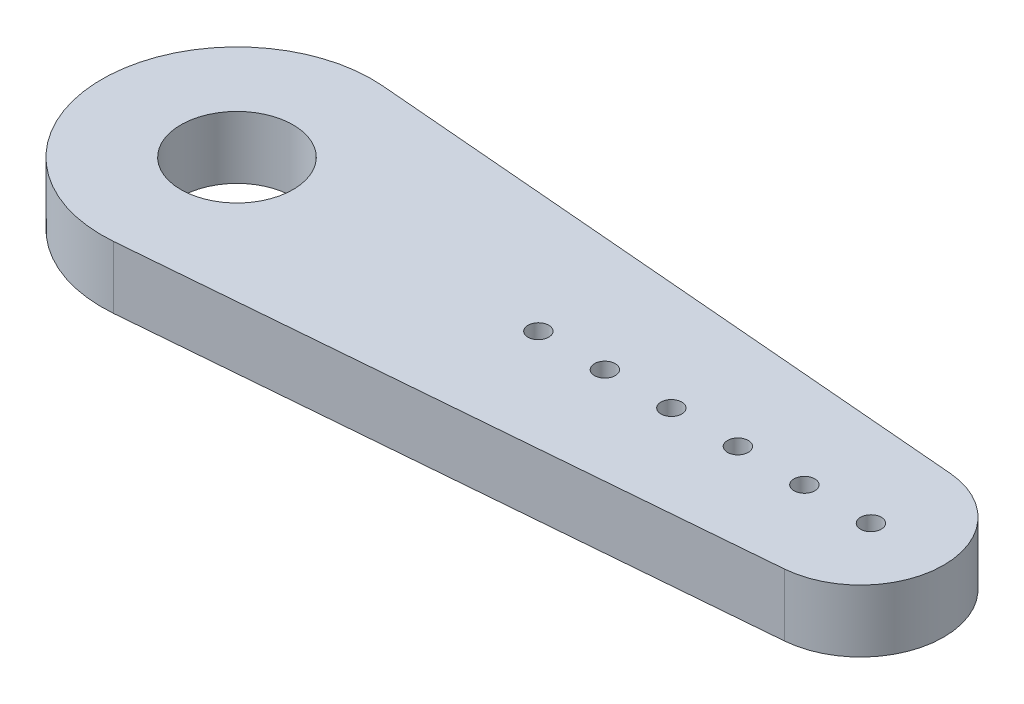
ISO-10303-21;
HEADER;
FILE_DESCRIPTION(('STEP AP214'),'2;1');
FILE_NAME('part.step','',(''),(''),'','','');
FILE_SCHEMA(('AUTOMOTIVE_DESIGN { 1 0 10303 214 1 1 1 1 }'));
ENDSEC;
DATA;
#1=APPLICATION_CONTEXT('core data for automotive mechanical design processes');
#2=APPLICATION_PROTOCOL_DEFINITION('international standard','automotive_design',2000,#1);
#3=PRODUCT_CONTEXT('',#1,'mechanical');
#4=PRODUCT('Part','Part','',(#3));
#5=PRODUCT_RELATED_PRODUCT_CATEGORY('part','',(#4));
#6=PRODUCT_DEFINITION_FORMATION('','',#4);
#7=PRODUCT_DEFINITION_CONTEXT('part definition',#1,'design');
#8=PRODUCT_DEFINITION('design','',#6,#7);
#9=PRODUCT_DEFINITION_SHAPE('','',#8);
#10=(LENGTH_UNIT() NAMED_UNIT(*) SI_UNIT(.MILLI.,.METRE.));
#11=(NAMED_UNIT(*) PLANE_ANGLE_UNIT() SI_UNIT($,.RADIAN.));
#12=(NAMED_UNIT(*) SI_UNIT($,.STERADIAN.) SOLID_ANGLE_UNIT());
#13=UNCERTAINTY_MEASURE_WITH_UNIT(LENGTH_MEASURE(1.E-05),#10,'distance_accuracy_value','');
#14=(GEOMETRIC_REPRESENTATION_CONTEXT(3) GLOBAL_UNCERTAINTY_ASSIGNED_CONTEXT((#13)) GLOBAL_UNIT_ASSIGNED_CONTEXT((#10,
#11,#12)) REPRESENTATION_CONTEXT('',''));
#15=CARTESIAN_POINT('',(0.,0.,0.));
#16=DIRECTION('',(0.,0.,1.));
#17=DIRECTION('',(1.,0.,0.));
#18=AXIS2_PLACEMENT_3D('',#15,#16,#17);
#19=CARTESIAN_POINT('',(0.,3.,0.));
#20=DIRECTION('',(0.,1.,0.));
#21=DIRECTION('',(0.,0.,1.));
#22=AXIS2_PLACEMENT_3D('',#19,#20,#21);
#23=PLANE('',#22);
#24=CARTESIAN_POINT('',(14.5,3.,0.));
#25=DIRECTION('',(0.,1.,0.));
#26=DIRECTION('',(0.,0.,1.));
#27=AXIS2_PLACEMENT_3D('',#24,#25,#26);
#28=CIRCLE('',#27,0.499999999999999);
#29=CARTESIAN_POINT('',(14.5,3.,0.499999999999999));
#30=VERTEX_POINT('',#29);
#31=EDGE_CURVE('E145',#30,#30,#28,.T.);
#32=ORIENTED_EDGE('',*,*,#31,.F.);
#33=EDGE_LOOP('',(#32));
#34=FACE_BOUND('',#33,.T.);
#35=CARTESIAN_POINT('',(20.9,3.,1.41980444495332E-13));
#36=DIRECTION('',(0.,1.,0.));
#37=DIRECTION('',(0.,0.,1.));
#38=AXIS2_PLACEMENT_3D('',#35,#36,#37);
#39=CIRCLE('',#38,0.499999999999999);
#40=CARTESIAN_POINT('',(20.9,3.,0.500000000000141));
#41=VERTEX_POINT('',#40);
#42=EDGE_CURVE('E133',#41,#41,#39,.T.);
#43=ORIENTED_EDGE('',*,*,#42,.F.);
#44=EDGE_LOOP('',(#43));
#45=FACE_BOUND('',#44,.T.);
#46=CARTESIAN_POINT('',(27.3,3.,0.));
#47=DIRECTION('',(0.,1.,0.));
#48=DIRECTION('',(0.,0.,1.));
#49=AXIS2_PLACEMENT_3D('',#46,#47,#48);
#50=CIRCLE('',#49,0.499999999999999);
#51=CARTESIAN_POINT('',(27.3,3.,0.500000000000006));
#52=VERTEX_POINT('',#51);
#53=EDGE_CURVE('E121',#52,#52,#50,.T.);
#54=ORIENTED_EDGE('',*,*,#53,.F.);
#55=EDGE_LOOP('',(#54));
#56=FACE_BOUND('',#55,.T.);
#57=CARTESIAN_POINT('',(0.,3.,0.));
#58=DIRECTION('',(0.,1.,0.));
#59=DIRECTION('',(0.,0.,1.));
#60=AXIS2_PLACEMENT_3D('',#57,#58,#59);
#61=CIRCLE('',#60,6.5);
#62=CARTESIAN_POINT('',(0.541666666666666,3.,-6.47739123584659));
#63=VERTEX_POINT('',#62);
#64=CARTESIAN_POINT('',(0.541666666666666,3.,6.47739123584659));
#65=VERTEX_POINT('',#64);
#66=EDGE_CURVE('E91',#63,#65,#61,.T.);
#67=ORIENTED_EDGE('',*,*,#66,.T.);
#68=DIRECTION('',(0.996521728591783,0.,-0.0833333333333333));
#69=VECTOR('',#68,1.);
#70=CARTESIAN_POINT('',(0.541666666666666,3.,6.47739123584659));
#71=LINE('',#70,#69);
#72=CARTESIAN_POINT('',(30.3333333333333,3.,3.98608691436713));
#73=VERTEX_POINT('',#72);
#74=EDGE_CURVE('E86',#65,#73,#71,.T.);
#75=ORIENTED_EDGE('',*,*,#74,.T.);
#76=CARTESIAN_POINT('',(30.,3.,0.));
#77=DIRECTION('',(0.,1.,0.));
#78=DIRECTION('',(0.,0.,1.));
#79=AXIS2_PLACEMENT_3D('',#76,#77,#78);
#80=CIRCLE('',#79,4.);
#81=CARTESIAN_POINT('',(30.3333333333333,3.,-3.98608691436713));
#82=VERTEX_POINT('',#81);
#83=EDGE_CURVE('E89',#73,#82,#80,.T.);
#84=ORIENTED_EDGE('',*,*,#83,.T.);
#85=DIRECTION('',(-0.996521728591783,0.,-0.0833333333333333));
#86=VECTOR('',#85,1.);
#87=CARTESIAN_POINT('',(0.541666666666666,3.,-6.47739123584659));
#88=LINE('',#87,#86);
#89=EDGE_CURVE('E56',#82,#63,#88,.T.);
#90=ORIENTED_EDGE('',*,*,#89,.T.);
#91=EDGE_LOOP('',(#67,#75,#84,#90));
#92=FACE_BOUND('',#91,.T.);
#93=CARTESIAN_POINT('',(30.5,3.,0.));
#94=DIRECTION('',(0.,1.,0.));
#95=DIRECTION('',(0.,0.,1.));
#96=AXIS2_PLACEMENT_3D('',#93,#94,#95);
#97=CIRCLE('',#96,0.499999999999999);
#98=CARTESIAN_POINT('',(30.5,3.,0.499999999999999));
#99=VERTEX_POINT('',#98);
#100=EDGE_CURVE('E106',#99,#99,#97,.T.);
#101=ORIENTED_EDGE('',*,*,#100,.F.);
#102=EDGE_LOOP('',(#101));
#103=FACE_BOUND('',#102,.T.);
#104=CARTESIAN_POINT('',(24.1,3.,0.));
#105=DIRECTION('',(0.,1.,0.));
#106=DIRECTION('',(0.,0.,1.));
#107=AXIS2_PLACEMENT_3D('',#104,#105,#106);
#108=CIRCLE('',#107,0.499999999999999);
#109=CARTESIAN_POINT('',(24.1,3.,0.50000000000006));
#110=VERTEX_POINT('',#109);
#111=EDGE_CURVE('E127',#110,#110,#108,.T.);
#112=ORIENTED_EDGE('',*,*,#111,.F.);
#113=EDGE_LOOP('',(#112));
#114=FACE_BOUND('',#113,.T.);
#115=CARTESIAN_POINT('',(17.7,3.,3.1870603202946E-13));
#116=DIRECTION('',(0.,1.,0.));
#117=DIRECTION('',(0.,0.,1.));
#118=AXIS2_PLACEMENT_3D('',#115,#116,#117);
#119=CIRCLE('',#118,0.499999999999999);
#120=CARTESIAN_POINT('',(17.7,3.,0.500000000000318));
#121=VERTEX_POINT('',#120);
#122=EDGE_CURVE('E139',#121,#121,#119,.T.);
#123=ORIENTED_EDGE('',*,*,#122,.F.);
#124=EDGE_LOOP('',(#123));
#125=FACE_BOUND('',#124,.T.);
#126=CARTESIAN_POINT('',(0.,3.,0.));
#127=DIRECTION('',(0.,1.,0.));
#128=DIRECTION('',(0.,0.,1.));
#129=AXIS2_PLACEMENT_3D('',#126,#127,#128);
#130=CIRCLE('',#129,2.7);
#131=CARTESIAN_POINT('',(0.,3.,2.7));
#132=VERTEX_POINT('',#131);
#133=EDGE_CURVE('E151',#132,#132,#130,.T.);
#134=ORIENTED_EDGE('',*,*,#133,.F.);
#135=EDGE_LOOP('',(#134));
#136=FACE_BOUND('',#135,.T.);
#137=ADVANCED_FACE('F39',(#34,#45,#56,#92,#103,#114,#125,#136),#23,.T.);
#138=CARTESIAN_POINT('',(0.,0.,0.));
#139=DIRECTION('',(0.,1.,0.));
#140=DIRECTION('',(0.,0.,1.));
#141=AXIS2_PLACEMENT_3D('',#138,#139,#140);
#142=PLANE('',#141);
#143=CARTESIAN_POINT('',(0.,0.,0.));
#144=DIRECTION('',(0.,1.,0.));
#145=DIRECTION('',(0.,0.,1.));
#146=AXIS2_PLACEMENT_3D('',#143,#144,#145);
#147=CIRCLE('',#146,6.5);
#148=CARTESIAN_POINT('',(0.541666666666666,0.,-6.47739123584659));
#149=VERTEX_POINT('',#148);
#150=CARTESIAN_POINT('',(0.541666666666666,0.,6.47739123584659));
#151=VERTEX_POINT('',#150);
#152=EDGE_CURVE('E103',#149,#151,#147,.T.);
#153=ORIENTED_EDGE('',*,*,#152,.F.);
#154=DIRECTION('',(-0.996521728591783,0.,-0.0833333333333333));
#155=VECTOR('',#154,1.);
#156=CARTESIAN_POINT('',(0.541666666666666,0.,-6.47739123584659));
#157=LINE('',#156,#155);
#158=CARTESIAN_POINT('',(30.3333333333333,0.,-3.98608691436713));
#159=VERTEX_POINT('',#158);
#160=EDGE_CURVE('E79',#159,#149,#157,.T.);
#161=ORIENTED_EDGE('',*,*,#160,.F.);
#162=CARTESIAN_POINT('',(30.,0.,0.));
#163=DIRECTION('',(0.,1.,0.));
#164=DIRECTION('',(0.,0.,1.));
#165=AXIS2_PLACEMENT_3D('',#162,#163,#164);
#166=CIRCLE('',#165,4.);
#167=CARTESIAN_POINT('',(30.3333333333333,0.,3.98608691436713));
#168=VERTEX_POINT('',#167);
#169=EDGE_CURVE('E73',#168,#159,#166,.T.);
#170=ORIENTED_EDGE('',*,*,#169,.F.);
#171=DIRECTION('',(0.996521728591783,0.,-0.0833333333333333));
#172=VECTOR('',#171,1.);
#173=CARTESIAN_POINT('',(0.541666666666666,0.,6.47739123584659));
#174=LINE('',#173,#172);
#175=EDGE_CURVE('E95',#151,#168,#174,.T.);
#176=ORIENTED_EDGE('',*,*,#175,.F.);
#177=EDGE_LOOP('',(#153,#161,#170,#176));
#178=FACE_BOUND('',#177,.T.);
#179=CARTESIAN_POINT('',(30.5,0.,0.));
#180=DIRECTION('',(0.,1.,0.));
#181=DIRECTION('',(0.,0.,1.));
#182=AXIS2_PLACEMENT_3D('',#179,#180,#181);
#183=CIRCLE('',#182,0.499999999999999);
#184=CARTESIAN_POINT('',(30.5,0.,0.499999999999999));
#185=VERTEX_POINT('',#184);
#186=EDGE_CURVE('E118',#185,#185,#183,.T.);
#187=ORIENTED_EDGE('',*,*,#186,.T.);
#188=EDGE_LOOP('',(#187));
#189=FACE_BOUND('',#188,.T.);
#190=CARTESIAN_POINT('',(27.3,0.,0.));
#191=DIRECTION('',(0.,1.,0.));
#192=DIRECTION('',(0.,0.,1.));
#193=AXIS2_PLACEMENT_3D('',#190,#191,#192);
#194=CIRCLE('',#193,0.499999999999999);
#195=CARTESIAN_POINT('',(27.3,0.,0.500000000000006));
#196=VERTEX_POINT('',#195);
#197=EDGE_CURVE('E124',#196,#196,#194,.T.);
#198=ORIENTED_EDGE('',*,*,#197,.T.);
#199=EDGE_LOOP('',(#198));
#200=FACE_BOUND('',#199,.T.);
#201=CARTESIAN_POINT('',(24.1,0.,0.));
#202=DIRECTION('',(0.,1.,0.));
#203=DIRECTION('',(0.,0.,1.));
#204=AXIS2_PLACEMENT_3D('',#201,#202,#203);
#205=CIRCLE('',#204,0.499999999999999);
#206=CARTESIAN_POINT('',(24.1,0.,0.50000000000006));
#207=VERTEX_POINT('',#206);
#208=EDGE_CURVE('E130',#207,#207,#205,.T.);
#209=ORIENTED_EDGE('',*,*,#208,.T.);
#210=EDGE_LOOP('',(#209));
#211=FACE_BOUND('',#210,.T.);
#212=CARTESIAN_POINT('',(20.9,0.,1.41980444495332E-13));
#213=DIRECTION('',(0.,1.,0.));
#214=DIRECTION('',(0.,0.,1.));
#215=AXIS2_PLACEMENT_3D('',#212,#213,#214);
#216=CIRCLE('',#215,0.499999999999999);
#217=CARTESIAN_POINT('',(20.9,0.,0.500000000000141));
#218=VERTEX_POINT('',#217);
#219=EDGE_CURVE('E136',#218,#218,#216,.T.);
#220=ORIENTED_EDGE('',*,*,#219,.T.);
#221=EDGE_LOOP('',(#220));
#222=FACE_BOUND('',#221,.T.);
#223=CARTESIAN_POINT('',(17.7,0.,3.1870603202946E-13));
#224=DIRECTION('',(0.,1.,0.));
#225=DIRECTION('',(0.,0.,1.));
#226=AXIS2_PLACEMENT_3D('',#223,#224,#225);
#227=CIRCLE('',#226,0.499999999999999);
#228=CARTESIAN_POINT('',(17.7,0.,0.500000000000318));
#229=VERTEX_POINT('',#228);
#230=EDGE_CURVE('E142',#229,#229,#227,.T.);
#231=ORIENTED_EDGE('',*,*,#230,.T.);
#232=EDGE_LOOP('',(#231));
#233=FACE_BOUND('',#232,.T.);
#234=CARTESIAN_POINT('',(14.5,0.,0.));
#235=DIRECTION('',(0.,1.,0.));
#236=DIRECTION('',(0.,0.,1.));
#237=AXIS2_PLACEMENT_3D('',#234,#235,#236);
#238=CIRCLE('',#237,0.499999999999999);
#239=CARTESIAN_POINT('',(14.5,0.,0.499999999999999));
#240=VERTEX_POINT('',#239);
#241=EDGE_CURVE('E148',#240,#240,#238,.T.);
#242=ORIENTED_EDGE('',*,*,#241,.T.);
#243=EDGE_LOOP('',(#242));
#244=FACE_BOUND('',#243,.T.);
#245=CARTESIAN_POINT('',(0.,0.,0.));
#246=DIRECTION('',(0.,1.,0.));
#247=DIRECTION('',(0.,0.,1.));
#248=AXIS2_PLACEMENT_3D('',#245,#246,#247);
#249=CIRCLE('',#248,2.7);
#250=CARTESIAN_POINT('',(0.,0.,2.7));
#251=VERTEX_POINT('',#250);
#252=EDGE_CURVE('E154',#251,#251,#249,.T.);
#253=ORIENTED_EDGE('',*,*,#252,.T.);
#254=EDGE_LOOP('',(#253));
#255=FACE_BOUND('',#254,.T.);
#256=ADVANCED_FACE('F114',(#178,#189,#200,#211,#222,#233,#244,#255),#142,.F.);
#257=CARTESIAN_POINT('',(0.,3.,0.));
#258=DIRECTION('',(0.,-1.,0.));
#259=DIRECTION('',(0.,0.,-1.));
#260=AXIS2_PLACEMENT_3D('',#257,#258,#259);
#261=CYLINDRICAL_SURFACE('',#260,6.5);
#262=ORIENTED_EDGE('',*,*,#152,.T.);
#263=DIRECTION('',(0.,-1.,0.));
#264=VECTOR('',#263,1.);
#265=CARTESIAN_POINT('',(0.541666666666666,3.,6.47739123584659));
#266=LINE('',#265,#264);
#267=EDGE_CURVE('E11',#65,#151,#266,.T.);
#268=ORIENTED_EDGE('',*,*,#267,.F.);
#269=ORIENTED_EDGE('',*,*,#66,.F.);
#270=DIRECTION('',(0.,-1.,0.));
#271=VECTOR('',#270,1.);
#272=CARTESIAN_POINT('',(0.541666666666666,3.,-6.47739123584659));
#273=LINE('',#272,#271);
#274=EDGE_CURVE('E99',#63,#149,#273,.T.);
#275=ORIENTED_EDGE('',*,*,#274,.T.);
#276=EDGE_LOOP('',(#262,#268,#269,#275));
#277=FACE_BOUND('',#276,.T.);
#278=ADVANCED_FACE('F41',(#277),#261,.T.);
#279=CARTESIAN_POINT('',(0.541666666666666,3.,6.47739123584659));
#280=DIRECTION('',(-0.0833333333333333,0.,-0.996521728591783));
#281=DIRECTION('',(-0.996521728591783,0.,0.0833333333333333));
#282=AXIS2_PLACEMENT_3D('',#279,#280,#281);
#283=PLANE('',#282);
#284=ORIENTED_EDGE('',*,*,#175,.T.);
#285=DIRECTION('',(0.,-1.,0.));
#286=VECTOR('',#285,1.);
#287=CARTESIAN_POINT('',(30.3333333333333,3.,3.98608691436713));
#288=LINE('',#287,#286);
#289=EDGE_CURVE('E48',#73,#168,#288,.T.);
#290=ORIENTED_EDGE('',*,*,#289,.F.);
#291=ORIENTED_EDGE('',*,*,#74,.F.);
#292=ORIENTED_EDGE('',*,*,#267,.T.);
#293=EDGE_LOOP('',(#284,#290,#291,#292));
#294=FACE_BOUND('',#293,.T.);
#295=ADVANCED_FACE('F94',(#294),#283,.F.);
#296=CARTESIAN_POINT('',(30.,3.,0.));
#297=DIRECTION('',(0.,-1.,0.));
#298=DIRECTION('',(0.,0.,-1.));
#299=AXIS2_PLACEMENT_3D('',#296,#297,#298);
#300=CYLINDRICAL_SURFACE('',#299,4.);
#301=ORIENTED_EDGE('',*,*,#169,.T.);
#302=DIRECTION('',(0.,-1.,0.));
#303=VECTOR('',#302,1.);
#304=CARTESIAN_POINT('',(30.3333333333333,3.,-3.98608691436713));
#305=LINE('',#304,#303);
#306=EDGE_CURVE('E96',#82,#159,#305,.T.);
#307=ORIENTED_EDGE('',*,*,#306,.F.);
#308=ORIENTED_EDGE('',*,*,#83,.F.);
#309=ORIENTED_EDGE('',*,*,#289,.T.);
#310=EDGE_LOOP('',(#301,#307,#308,#309));
#311=FACE_BOUND('',#310,.T.);
#312=ADVANCED_FACE('F97',(#311),#300,.T.);
#313=CARTESIAN_POINT('',(0.541666666666666,3.,-6.47739123584659));
#314=DIRECTION('',(-0.0833333333333333,0.,0.996521728591783));
#315=DIRECTION('',(0.996521728591783,0.,0.0833333333333333));
#316=AXIS2_PLACEMENT_3D('',#313,#314,#315);
#317=PLANE('',#316);
#318=ORIENTED_EDGE('',*,*,#160,.T.);
#319=ORIENTED_EDGE('',*,*,#274,.F.);
#320=ORIENTED_EDGE('',*,*,#89,.F.);
#321=ORIENTED_EDGE('',*,*,#306,.T.);
#322=EDGE_LOOP('',(#318,#319,#320,#321));
#323=FACE_BOUND('',#322,.T.);
#324=ADVANCED_FACE('F111',(#323),#317,.F.);
#325=CARTESIAN_POINT('',(30.5,3.,0.));
#326=DIRECTION('',(0.,-1.,0.));
#327=DIRECTION('',(0.,0.,-1.));
#328=AXIS2_PLACEMENT_3D('',#325,#326,#327);
#329=CYLINDRICAL_SURFACE('',#328,0.499999999999999);
#330=ORIENTED_EDGE('',*,*,#100,.T.);
#331=EDGE_LOOP('',(#330));
#332=FACE_BOUND('',#331,.T.);
#333=ORIENTED_EDGE('',*,*,#186,.F.);
#334=EDGE_LOOP('',(#333));
#335=FACE_BOUND('',#334,.T.);
#336=ADVANCED_FACE('F173',(#332,#335),#329,.F.);
#337=CARTESIAN_POINT('',(27.3,3.,0.));
#338=DIRECTION('',(0.,-1.,0.));
#339=DIRECTION('',(0.,0.,-1.));
#340=AXIS2_PLACEMENT_3D('',#337,#338,#339);
#341=CYLINDRICAL_SURFACE('',#340,0.499999999999999);
#342=ORIENTED_EDGE('',*,*,#53,.T.);
#343=EDGE_LOOP('',(#342));
#344=FACE_BOUND('',#343,.T.);
#345=ORIENTED_EDGE('',*,*,#197,.F.);
#346=EDGE_LOOP('',(#345));
#347=FACE_BOUND('',#346,.T.);
#348=ADVANCED_FACE('F218',(#344,#347),#341,.F.);
#349=CARTESIAN_POINT('',(24.1,3.,0.));
#350=DIRECTION('',(0.,-1.,0.));
#351=DIRECTION('',(0.,0.,-1.));
#352=AXIS2_PLACEMENT_3D('',#349,#350,#351);
#353=CYLINDRICAL_SURFACE('',#352,0.499999999999999);
#354=ORIENTED_EDGE('',*,*,#111,.T.);
#355=EDGE_LOOP('',(#354));
#356=FACE_BOUND('',#355,.T.);
#357=ORIENTED_EDGE('',*,*,#208,.F.);
#358=EDGE_LOOP('',(#357));
#359=FACE_BOUND('',#358,.T.);
#360=ADVANCED_FACE('F226',(#356,#359),#353,.F.);
#361=CARTESIAN_POINT('',(20.9,3.,1.41980444495332E-13));
#362=DIRECTION('',(0.,-1.,0.));
#363=DIRECTION('',(0.,0.,-1.));
#364=AXIS2_PLACEMENT_3D('',#361,#362,#363);
#365=CYLINDRICAL_SURFACE('',#364,0.499999999999999);
#366=ORIENTED_EDGE('',*,*,#42,.T.);
#367=EDGE_LOOP('',(#366));
#368=FACE_BOUND('',#367,.T.);
#369=ORIENTED_EDGE('',*,*,#219,.F.);
#370=EDGE_LOOP('',(#369));
#371=FACE_BOUND('',#370,.T.);
#372=ADVANCED_FACE('F234',(#368,#371),#365,.F.);
#373=CARTESIAN_POINT('',(17.7,3.,3.1870603202946E-13));
#374=DIRECTION('',(0.,-1.,0.));
#375=DIRECTION('',(0.,0.,-1.));
#376=AXIS2_PLACEMENT_3D('',#373,#374,#375);
#377=CYLINDRICAL_SURFACE('',#376,0.499999999999999);
#378=ORIENTED_EDGE('',*,*,#122,.T.);
#379=EDGE_LOOP('',(#378));
#380=FACE_BOUND('',#379,.T.);
#381=ORIENTED_EDGE('',*,*,#230,.F.);
#382=EDGE_LOOP('',(#381));
#383=FACE_BOUND('',#382,.T.);
#384=ADVANCED_FACE('F243',(#380,#383),#377,.F.);
#385=CARTESIAN_POINT('',(14.5,3.,0.));
#386=DIRECTION('',(0.,-1.,0.));
#387=DIRECTION('',(0.,0.,-1.));
#388=AXIS2_PLACEMENT_3D('',#385,#386,#387);
#389=CYLINDRICAL_SURFACE('',#388,0.499999999999999);
#390=ORIENTED_EDGE('',*,*,#31,.T.);
#391=EDGE_LOOP('',(#390));
#392=FACE_BOUND('',#391,.T.);
#393=ORIENTED_EDGE('',*,*,#241,.F.);
#394=EDGE_LOOP('',(#393));
#395=FACE_BOUND('',#394,.T.);
#396=ADVANCED_FACE('F252',(#392,#395),#389,.F.);
#397=CARTESIAN_POINT('',(0.,3.,0.));
#398=DIRECTION('',(0.,-1.,0.));
#399=DIRECTION('',(0.,0.,-1.));
#400=AXIS2_PLACEMENT_3D('',#397,#398,#399);
#401=CYLINDRICAL_SURFACE('',#400,2.7);
#402=ORIENTED_EDGE('',*,*,#133,.T.);
#403=EDGE_LOOP('',(#402));
#404=FACE_BOUND('',#403,.T.);
#405=ORIENTED_EDGE('',*,*,#252,.F.);
#406=EDGE_LOOP('',(#405));
#407=FACE_BOUND('',#406,.T.);
#408=ADVANCED_FACE('F160',(#404,#407),#401,.F.);
#409=CLOSED_SHELL('',(#137,#256,#278,#295,#312,#324,#336,#348,#360,#372,#384,#396,#408));
#410=MANIFOLD_SOLID_BREP('B2',#409);
#411=ADVANCED_BREP_SHAPE_REPRESENTATION('',(#18,#410),#14);
#412=SHAPE_DEFINITION_REPRESENTATION(#9,#411);
ENDSEC;
END-ISO-10303-21;
